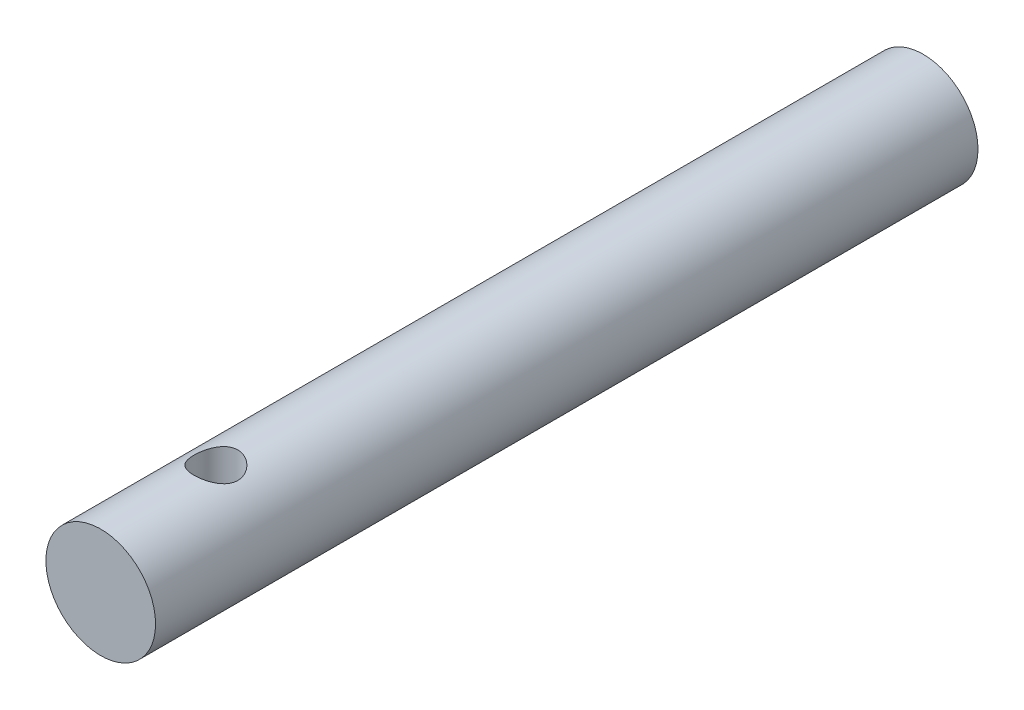
ISO-10303-21;
HEADER;
FILE_DESCRIPTION(('STEP AP214'),'2;1');
FILE_NAME('part.step','',(''),(''),'','','');
FILE_SCHEMA(('AUTOMOTIVE_DESIGN { 1 0 10303 214 1 1 1 1 }'));
ENDSEC;
DATA;
#1=APPLICATION_CONTEXT('core data for automotive mechanical design processes');
#2=APPLICATION_PROTOCOL_DEFINITION('international standard','automotive_design',2000,#1);
#3=PRODUCT_CONTEXT('',#1,'mechanical');
#4=PRODUCT('Part','Part','',(#3));
#5=PRODUCT_RELATED_PRODUCT_CATEGORY('part','',(#4));
#6=PRODUCT_DEFINITION_FORMATION('','',#4);
#7=PRODUCT_DEFINITION_CONTEXT('part definition',#1,'design');
#8=PRODUCT_DEFINITION('design','',#6,#7);
#9=PRODUCT_DEFINITION_SHAPE('','',#8);
#10=(LENGTH_UNIT() NAMED_UNIT(*) SI_UNIT(.MILLI.,.METRE.));
#11=(NAMED_UNIT(*) PLANE_ANGLE_UNIT() SI_UNIT($,.RADIAN.));
#12=(NAMED_UNIT(*) SI_UNIT($,.STERADIAN.) SOLID_ANGLE_UNIT());
#13=UNCERTAINTY_MEASURE_WITH_UNIT(LENGTH_MEASURE(1.E-05),#10,'distance_accuracy_value','');
#14=(GEOMETRIC_REPRESENTATION_CONTEXT(3) GLOBAL_UNCERTAINTY_ASSIGNED_CONTEXT((#13)) GLOBAL_UNIT_ASSIGNED_CONTEXT((#10,
#11,#12)) REPRESENTATION_CONTEXT('',''));
#15=CARTESIAN_POINT('',(0.,0.,0.));
#16=DIRECTION('',(0.,0.,1.));
#17=DIRECTION('',(1.,0.,0.));
#18=AXIS2_PLACEMENT_3D('',#15,#16,#17);
#19=CARTESIAN_POINT('',(0.,0.,150.));
#20=DIRECTION('',(0.,0.,-1.));
#21=DIRECTION('',(-1.,0.,0.));
#22=AXIS2_PLACEMENT_3D('',#19,#20,#21);
#23=CYLINDRICAL_SURFACE('',#22,10.);
#24=CARTESIAN_POINT('',(0.,-10.,133.));
#25=CARTESIAN_POINT('',(0.107549581345537,-9.99999886871264,132.999998425067));
#26=CARTESIAN_POINT('',(0.215132147940362,-9.99825999367799,132.99565632892));
#27=CARTESIAN_POINT('',(0.429535200549549,-9.99134740691108,132.978326617216));
#28=CARTESIAN_POINT('',(0.536355162703302,-9.98617152790588,132.965333546597));
#29=CARTESIAN_POINT('',(0.748635856497416,-9.97250573560117,132.930791965449));
#30=CARTESIAN_POINT('',(0.854093134440867,-9.96400865312143,132.90922494538));
#31=CARTESIAN_POINT('',(1.06266761114009,-9.94393017211574,132.857758269563));
#32=CARTESIAN_POINT('',(1.16578384227259,-9.932347522545,132.827855233745));
#33=CARTESIAN_POINT('',(1.46979509681069,-9.89349112162205,132.726277191284));
#34=CARTESIAN_POINT('',(1.66629107461992,-9.86204458846134,132.642578180994));
#35=CARTESIAN_POINT('',(2.04217417878101,-9.79113035538708,132.44595378265));
#36=CARTESIAN_POINT('',(2.22156721456798,-9.75166544086262,132.333038539885));
#37=CARTESIAN_POINT('',(2.56699339938209,-9.66661825353092,132.075531245478));
#38=CARTESIAN_POINT('',(2.73212223266508,-9.62084608086599,131.929787289424));
#39=CARTESIAN_POINT('',(3.03635232313263,-9.52921139577231,131.613199390848));
#40=CARTESIAN_POINT('',(3.17544084661153,-9.48334885017047,131.442343240983));
#41=CARTESIAN_POINT('',(3.42974847409894,-9.39445587657958,131.071144031434));
#42=CARTESIAN_POINT('',(3.54362978572888,-9.35164233015934,130.869827073936));
#43=CARTESIAN_POINT('',(3.73550961465235,-9.2766729328807,130.448927157199));
#44=CARTESIAN_POINT('',(3.81352517485723,-9.24451202207145,130.229352932259));
#45=CARTESIAN_POINT('',(3.92779760260542,-9.19652715590089,129.788575344314));
#46=CARTESIAN_POINT('',(3.96578791979826,-9.18002840771385,129.567897531912));
#47=CARTESIAN_POINT('',(4.00434593508728,-9.16328008038142,129.122730000323));
#48=CARTESIAN_POINT('',(4.00493203570086,-9.16302251073202,128.898242209989));
#49=CARTESIAN_POINT('',(3.9699787321474,-9.17821000534301,128.468486657777));
#50=CARTESIAN_POINT('',(3.93695062778272,-9.19256349925666,128.262968571234));
#51=CARTESIAN_POINT('',(3.83989376129508,-9.23352375055553,127.86068088765));
#52=CARTESIAN_POINT('',(3.77585958980134,-9.26013264599921,127.663912823694));
#53=CARTESIAN_POINT('',(3.61738946491141,-9.32318970221162,127.279964327708));
#54=CARTESIAN_POINT('',(3.5223597245794,-9.35982758573423,127.093061521918));
#55=CARTESIAN_POINT('',(3.30501292151571,-9.43876232767926,126.73716836725));
#56=CARTESIAN_POINT('',(3.18268561021591,-9.48106130910411,126.568184781187));
#57=CARTESIAN_POINT('',(2.90310119889357,-9.57053473488081,126.239180542404));
#58=CARTESIAN_POINT('',(2.74387492593718,-9.61783329953252,126.08086254111));
#59=CARTESIAN_POINT('',(2.40062885486449,-9.70919649915615,125.792631043994));
#60=CARTESIAN_POINT('',(2.21660413066997,-9.75326048890393,125.662723205179));
#61=CARTESIAN_POINT('',(1.82415530521055,-9.83429362529359,125.432765105169));
#62=CARTESIAN_POINT('',(1.61532098269266,-9.87110540190899,125.333355437606));
#63=CARTESIAN_POINT('',(1.18204753096606,-9.93229656657448,125.171664277844));
#64=CARTESIAN_POINT('',(0.957616393699407,-9.95668226924746,125.109363924885));
#65=CARTESIAN_POINT('',(0.513791775215601,-9.98912279013839,125.027103409161));
#66=CARTESIAN_POINT('',(0.294886587971151,-9.99805891667034,125.004855091493));
#67=CARTESIAN_POINT('',(-0.143690619615697,-10.0013695702126,124.996573798943));
#68=CARTESIAN_POINT('',(-0.363362426448175,-9.99574787164577,125.010531436905));
#69=CARTESIAN_POINT('',(-0.786865478243648,-9.97115134127512,125.072583505104));
#70=CARTESIAN_POINT('',(-0.990964983549755,-9.95278782691064,125.119115960703));
#71=CARTESIAN_POINT('',(-1.38827085612274,-9.90518882810983,125.242871416619));
#72=CARTESIAN_POINT('',(-1.58147582045411,-9.87595194712999,125.320098359335));
#73=CARTESIAN_POINT('',(-1.95815757162884,-9.80833189541687,125.505569879362));
#74=CARTESIAN_POINT('',(-2.14115604549353,-9.76969631959847,125.614690944095));
#75=CARTESIAN_POINT('',(-2.4868871825104,-9.68746729490809,125.859880647803));
#76=CARTESIAN_POINT('',(-2.64961168158684,-9.64387186219643,125.995960085814));
#77=CARTESIAN_POINT('',(-2.96144608598878,-9.55290235277181,126.301740025933));
#78=CARTESIAN_POINT('',(-3.10894786734726,-9.50546882853787,126.473067083141));
#79=CARTESIAN_POINT('',(-3.37350239509234,-9.4148334583058,126.83888016589));
#80=CARTESIAN_POINT('',(-3.4905501236659,-9.37163231039242,127.033370000199));
#81=CARTESIAN_POINT('',(-3.69161500286276,-9.2942859982933,127.442923389673));
#82=CARTESIAN_POINT('',(-3.77530118531766,-9.26023261821741,127.658168000243));
#83=CARTESIAN_POINT('',(-3.90459244315908,-9.20647346903737,128.101467301613));
#84=CARTESIAN_POINT('',(-3.95022562452798,-9.18675711197461,128.329512404842));
#85=CARTESIAN_POINT('',(-3.99943122157417,-9.16543518780389,128.774255809844));
#86=CARTESIAN_POINT('',(-4.0057941177721,-9.16262842667612,128.990589701895));
#87=CARTESIAN_POINT('',(-3.98360636538274,-9.17229671415009,129.421089692721));
#88=CARTESIAN_POINT('',(-3.9550601501471,-9.18476982225497,129.635256063282));
#89=CARTESIAN_POINT('',(-3.86614256488129,-9.2225330048627,130.04666446089));
#90=CARTESIAN_POINT('',(-3.80707437387707,-9.2472967218297,130.244240846221));
#91=CARTESIAN_POINT('',(-3.66001151041638,-9.30647993934965,130.62675696179));
#92=CARTESIAN_POINT('',(-3.57200884934551,-9.34090210615104,130.811693185111));
#93=CARTESIAN_POINT('',(-3.36374310804135,-9.4179725282647,131.175220410709));
#94=CARTESIAN_POINT('',(-3.24192140926545,-9.46097893410836,131.352841830688));
#95=CARTESIAN_POINT('',(-2.97179350239179,-9.54927479921251,131.685982142625));
#96=CARTESIAN_POINT('',(-2.82347931168582,-9.59456494363941,131.84149434729));
#97=CARTESIAN_POINT('',(-2.49297412446701,-9.68587647140964,132.136423592531));
#98=CARTESIAN_POINT('',(-2.30921017071956,-9.73175488236392,132.274143383982));
#99=CARTESIAN_POINT('',(-2.01716584575534,-9.7949502762577,132.456048108938));
#100=CARTESIAN_POINT('',(-1.91699501972426,-9.81509269692655,132.512607063853));
#101=CARTESIAN_POINT('',(-1.71180110982481,-9.85294835133019,132.617037995405));
#102=CARTESIAN_POINT('',(-1.60678027559742,-9.87066269647665,132.664913949808));
#103=CARTESIAN_POINT('',(-1.39454646904327,-9.9028559935491,132.750747984685));
#104=CARTESIAN_POINT('',(-1.28740777135871,-9.91738778532477,132.788870154747));
#105=CARTESIAN_POINT('',(-1.06995577523382,-9.94319722915714,132.855921347721));
#106=CARTESIAN_POINT('',(-0.959643983352608,-9.95447639837582,132.88485465735));
#107=CARTESIAN_POINT('',(-0.736945215856824,-9.97343330649399,132.933174836149));
#108=CARTESIAN_POINT('',(-0.624564263591269,-9.98112017494336,132.952585911645));
#109=CARTESIAN_POINT('',(-0.398419132407593,-9.99270031578293,132.981738570666));
#110=CARTESIAN_POINT('',(-0.284655994966345,-9.99659628445551,132.991487026834));
#111=CARTESIAN_POINT('',(-0.113830463425488,-9.99951445883957,132.998785895573));
#112=CARTESIAN_POINT('',(-0.0569198512645281,-10.0000005987258,133.000000833522));
#113=CARTESIAN_POINT('',(0.,-10.,133.));
#114=B_SPLINE_CURVE_WITH_KNOTS('',3,(#24,#25,#26,#27,#28,#29,#30,#31,#32,#33,#34,#35,#36,#37,
#38,#39,#40,#41,#42,#43,#44,#45,#46,#47,#48,#49,#50,#51,#52,#53,#54,#55,#56,#57,#58,#59,#60,#61,
#62,#63,#64,#65,#66,#67,#68,#69,#70,#71,#72,#73,#74,#75,#76,#77,#78,#79,#80,#81,#82,#83,#84,#85,
#86,#87,#88,#89,#90,#91,#92,#93,#94,#95,#96,#97,#98,#99,#100,#101,#102,#103,#104,#105,#106,#107,
#108,#109,#110,#111,#112,#113),.UNSPECIFIED.,.T.,.F.,(4,2,2,2,2,2,2,2,2,2,2,2,2,2,2,2,2,2,2,2,2,
2,2,2,2,2,2,2,2,2,2,2,2,2,2,2,2,2,2,2,2,2,2,2,4),(0.,0.322603993422155,0.645411604786482,
0.968919914471231,1.29255959093094,1.93701523385824,2.58124739027476,3.25313995292303,
3.9253602176033,4.62749749529945,5.32930078128045,5.99927442509166,6.66891844572485,
7.29195888698824,7.91510806412269,8.55097484497805,9.1870807577654,9.87235930273287,
10.5577741757964,11.2567305822579,11.9553314412776,12.6125760095619,13.2696501904034,
13.8972014302891,14.5248332988777,15.171662586967,15.8187515089811,16.50856181149,
17.1984856998767,17.8950932218183,18.5911857719204,19.2371857868567,19.8831037702626,
20.5034786899771,21.124025035105,21.7801016801356,22.4363763459696,23.1352007896785,
23.4851924266232,23.8350233218042,24.1785111324565,24.52183846562,24.8642884495951,
25.2064946871486,25.3772305569977),.UNSPECIFIED.);
#115=CARTESIAN_POINT('',(0.,-10.,133.));
#116=VERTEX_POINT('',#115);
#117=EDGE_CURVE('E10',#116,#116,#114,.T.);
#118=ORIENTED_EDGE('',*,*,#117,.T.);
#119=EDGE_LOOP('',(#118));
#120=FACE_BOUND('',#119,.T.);
#121=CARTESIAN_POINT('',(0.,10.,133.));
#122=CARTESIAN_POINT('',(-0.107549581345537,9.99999886871264,132.999998425067));
#123=CARTESIAN_POINT('',(-0.215132147940362,9.99825999367799,132.99565632892));
#124=CARTESIAN_POINT('',(-0.429535200549549,9.99134740691108,132.978326617216));
#125=CARTESIAN_POINT('',(-0.536355162703302,9.98617152790588,132.965333546597));
#126=CARTESIAN_POINT('',(-0.748635856497416,9.97250573560117,132.930791965449));
#127=CARTESIAN_POINT('',(-0.854093134440867,9.96400865312143,132.90922494538));
#128=CARTESIAN_POINT('',(-1.06266761114009,9.94393017211574,132.857758269563));
#129=CARTESIAN_POINT('',(-1.16578384227259,9.932347522545,132.827855233745));
#130=CARTESIAN_POINT('',(-1.46979509681069,9.89349112162205,132.726277191284));
#131=CARTESIAN_POINT('',(-1.66629107461992,9.86204458846134,132.642578180994));
#132=CARTESIAN_POINT('',(-2.04217417878101,9.79113035538708,132.44595378265));
#133=CARTESIAN_POINT('',(-2.22156721456798,9.75166544086262,132.333038539885));
#134=CARTESIAN_POINT('',(-2.56699339938209,9.66661825353092,132.075531245478));
#135=CARTESIAN_POINT('',(-2.73212223266508,9.62084608086599,131.929787289424));
#136=CARTESIAN_POINT('',(-3.03635232313263,9.52921139577231,131.613199390848));
#137=CARTESIAN_POINT('',(-3.17544084661153,9.48334885017047,131.442343240983));
#138=CARTESIAN_POINT('',(-3.42974847409894,9.39445587657958,131.071144031434));
#139=CARTESIAN_POINT('',(-3.54362978572888,9.35164233015934,130.869827073936));
#140=CARTESIAN_POINT('',(-3.73550961465235,9.2766729328807,130.448927157199));
#141=CARTESIAN_POINT('',(-3.81352517485723,9.24451202207145,130.229352932259));
#142=CARTESIAN_POINT('',(-3.92779760260542,9.19652715590089,129.788575344314));
#143=CARTESIAN_POINT('',(-3.96578791979826,9.18002840771385,129.567897531912));
#144=CARTESIAN_POINT('',(-4.00434593508728,9.16328008038142,129.122730000323));
#145=CARTESIAN_POINT('',(-4.00493203570086,9.16302251073202,128.898242209989));
#146=CARTESIAN_POINT('',(-3.9699787321474,9.17821000534301,128.468486657777));
#147=CARTESIAN_POINT('',(-3.93695062778272,9.19256349925666,128.262968571234));
#148=CARTESIAN_POINT('',(-3.83989376129508,9.23352375055553,127.86068088765));
#149=CARTESIAN_POINT('',(-3.77585958980134,9.26013264599921,127.663912823694));
#150=CARTESIAN_POINT('',(-3.61738946491141,9.32318970221162,127.279964327708));
#151=CARTESIAN_POINT('',(-3.5223597245794,9.35982758573423,127.093061521918));
#152=CARTESIAN_POINT('',(-3.30501292151571,9.43876232767926,126.73716836725));
#153=CARTESIAN_POINT('',(-3.18268561021591,9.48106130910411,126.568184781187));
#154=CARTESIAN_POINT('',(-2.90310119889357,9.57053473488081,126.239180542404));
#155=CARTESIAN_POINT('',(-2.74387492593718,9.61783329953252,126.08086254111));
#156=CARTESIAN_POINT('',(-2.40062885486449,9.70919649915615,125.792631043994));
#157=CARTESIAN_POINT('',(-2.21660413066997,9.75326048890393,125.662723205179));
#158=CARTESIAN_POINT('',(-1.82415530521055,9.83429362529359,125.432765105169));
#159=CARTESIAN_POINT('',(-1.61532098269266,9.87110540190899,125.333355437606));
#160=CARTESIAN_POINT('',(-1.18204753096606,9.93229656657448,125.171664277844));
#161=CARTESIAN_POINT('',(-0.957616393699407,9.95668226924746,125.109363924885));
#162=CARTESIAN_POINT('',(-0.513791775215601,9.98912279013839,125.027103409161));
#163=CARTESIAN_POINT('',(-0.294886587971151,9.99805891667034,125.004855091493));
#164=CARTESIAN_POINT('',(0.143690619615697,10.0013695702126,124.996573798943));
#165=CARTESIAN_POINT('',(0.363362426448175,9.99574787164577,125.010531436905));
#166=CARTESIAN_POINT('',(0.786865478243648,9.97115134127512,125.072583505104));
#167=CARTESIAN_POINT('',(0.990964983549755,9.95278782691064,125.119115960703));
#168=CARTESIAN_POINT('',(1.38827085612274,9.90518882810983,125.242871416619));
#169=CARTESIAN_POINT('',(1.58147582045411,9.87595194712999,125.320098359335));
#170=CARTESIAN_POINT('',(1.95815757162884,9.80833189541687,125.505569879362));
#171=CARTESIAN_POINT('',(2.14115604549353,9.76969631959847,125.614690944095));
#172=CARTESIAN_POINT('',(2.4868871825104,9.68746729490809,125.859880647803));
#173=CARTESIAN_POINT('',(2.64961168158684,9.64387186219643,125.995960085814));
#174=CARTESIAN_POINT('',(2.96144608598878,9.55290235277181,126.301740025933));
#175=CARTESIAN_POINT('',(3.10894786734726,9.50546882853787,126.473067083141));
#176=CARTESIAN_POINT('',(3.37350239509234,9.4148334583058,126.83888016589));
#177=CARTESIAN_POINT('',(3.4905501236659,9.37163231039242,127.033370000199));
#178=CARTESIAN_POINT('',(3.69161500286276,9.2942859982933,127.442923389673));
#179=CARTESIAN_POINT('',(3.77530118531766,9.26023261821741,127.658168000243));
#180=CARTESIAN_POINT('',(3.90459244315908,9.20647346903737,128.101467301613));
#181=CARTESIAN_POINT('',(3.95022562452798,9.18675711197461,128.329512404842));
#182=CARTESIAN_POINT('',(3.99943122157417,9.16543518780389,128.774255809844));
#183=CARTESIAN_POINT('',(4.0057941177721,9.16262842667612,128.990589701895));
#184=CARTESIAN_POINT('',(3.98360636538274,9.17229671415009,129.421089692721));
#185=CARTESIAN_POINT('',(3.9550601501471,9.18476982225497,129.635256063282));
#186=CARTESIAN_POINT('',(3.86614256488129,9.2225330048627,130.04666446089));
#187=CARTESIAN_POINT('',(3.80707437387707,9.2472967218297,130.244240846221));
#188=CARTESIAN_POINT('',(3.66001151041638,9.30647993934965,130.62675696179));
#189=CARTESIAN_POINT('',(3.57200884934551,9.34090210615104,130.811693185111));
#190=CARTESIAN_POINT('',(3.36374310804135,9.4179725282647,131.175220410709));
#191=CARTESIAN_POINT('',(3.24192140926545,9.46097893410836,131.352841830688));
#192=CARTESIAN_POINT('',(2.97179350239179,9.54927479921251,131.685982142625));
#193=CARTESIAN_POINT('',(2.82347931168582,9.59456494363941,131.84149434729));
#194=CARTESIAN_POINT('',(2.49297412446701,9.68587647140964,132.136423592531));
#195=CARTESIAN_POINT('',(2.30921017071956,9.73175488236392,132.274143383982));
#196=CARTESIAN_POINT('',(2.01716584575534,9.7949502762577,132.456048108938));
#197=CARTESIAN_POINT('',(1.91699501972426,9.81509269692655,132.512607063853));
#198=CARTESIAN_POINT('',(1.71180110982481,9.85294835133019,132.617037995405));
#199=CARTESIAN_POINT('',(1.60678027559742,9.87066269647665,132.664913949808));
#200=CARTESIAN_POINT('',(1.39454646904327,9.9028559935491,132.750747984685));
#201=CARTESIAN_POINT('',(1.28740777135871,9.91738778532477,132.788870154747));
#202=CARTESIAN_POINT('',(1.06995577523382,9.94319722915714,132.855921347721));
#203=CARTESIAN_POINT('',(0.959643983352608,9.95447639837582,132.88485465735));
#204=CARTESIAN_POINT('',(0.736945215856824,9.97343330649399,132.933174836149));
#205=CARTESIAN_POINT('',(0.624564263591269,9.98112017494336,132.952585911645));
#206=CARTESIAN_POINT('',(0.398419132407593,9.99270031578293,132.981738570666));
#207=CARTESIAN_POINT('',(0.284655994966345,9.99659628445551,132.991487026834));
#208=CARTESIAN_POINT('',(0.113830463425488,9.99951445883957,132.998785895573));
#209=CARTESIAN_POINT('',(0.0569198512645281,10.0000005987258,133.000000833522));
#210=CARTESIAN_POINT('',(0.,10.,133.));
#211=B_SPLINE_CURVE_WITH_KNOTS('',3,(#121,#122,#123,#124,#125,#126,#127,#128,#129,#130,#131,
#132,#133,#134,#135,#136,#137,#138,#139,#140,#141,#142,#143,#144,#145,#146,#147,#148,#149,#150,
#151,#152,#153,#154,#155,#156,#157,#158,#159,#160,#161,#162,#163,#164,#165,#166,#167,#168,#169,
#170,#171,#172,#173,#174,#175,#176,#177,#178,#179,#180,#181,#182,#183,#184,#185,#186,#187,#188,
#189,#190,#191,#192,#193,#194,#195,#196,#197,#198,#199,#200,#201,#202,#203,#204,#205,#206,#207,
#208,#209,#210),.UNSPECIFIED.,.T.,.F.,(4,2,2,2,2,2,2,2,2,2,2,2,2,2,2,2,2,2,2,2,2,2,2,2,2,2,2,2,
2,2,2,2,2,2,2,2,2,2,2,2,2,2,2,2,4),(0.,0.322603993422155,0.645411604786482,0.968919914471231,
1.29255959093094,1.93701523385824,2.58124739027476,3.25313995292303,3.9253602176033,
4.62749749529945,5.32930078128045,5.99927442509166,6.66891844572485,7.29195888698824,
7.91510806412269,8.55097484497805,9.1870807577654,9.87235930273287,10.5577741757964,
11.2567305822579,11.9553314412776,12.6125760095619,13.2696501904034,13.8972014302891,
14.5248332988777,15.171662586967,15.8187515089811,16.50856181149,17.1984856998767,
17.8950932218183,18.5911857719204,19.2371857868567,19.8831037702626,20.5034786899771,
21.124025035105,21.7801016801356,22.4363763459696,23.1352007896785,23.4851924266232,
23.8350233218042,24.1785111324565,24.52183846562,24.8642884495951,25.2064946871486,
25.3772305569977),.UNSPECIFIED.);
#212=CARTESIAN_POINT('',(0.,10.,133.));
#213=VERTEX_POINT('',#212);
#214=EDGE_CURVE('E45',#213,#213,#211,.T.);
#215=ORIENTED_EDGE('',*,*,#214,.T.);
#216=EDGE_LOOP('',(#215));
#217=FACE_BOUND('',#216,.T.);
#218=CARTESIAN_POINT('',(0.,0.,150.));
#219=DIRECTION('',(0.,0.,1.));
#220=DIRECTION('',(1.,0.,0.));
#221=AXIS2_PLACEMENT_3D('',#218,#219,#220);
#222=CIRCLE('',#221,10.);
#223=CARTESIAN_POINT('',(10.,0.,150.));
#224=VERTEX_POINT('',#223);
#225=EDGE_CURVE('E49',#224,#224,#222,.T.);
#226=ORIENTED_EDGE('',*,*,#225,.F.);
#227=EDGE_LOOP('',(#226));
#228=FACE_BOUND('',#227,.T.);
#229=CARTESIAN_POINT('',(0.,0.,0.));
#230=DIRECTION('',(0.,0.,1.));
#231=DIRECTION('',(1.,0.,0.));
#232=AXIS2_PLACEMENT_3D('',#229,#230,#231);
#233=CIRCLE('',#232,10.);
#234=CARTESIAN_POINT('',(10.,0.,0.));
#235=VERTEX_POINT('',#234);
#236=EDGE_CURVE('E53',#235,#235,#233,.T.);
#237=ORIENTED_EDGE('',*,*,#236,.T.);
#238=EDGE_LOOP('',(#237));
#239=FACE_BOUND('',#238,.T.);
#240=ADVANCED_FACE('F35',(#120,#217,#228,#239),#23,.T.);
#241=CARTESIAN_POINT('',(0.,0.,150.));
#242=DIRECTION('',(0.,0.,1.));
#243=DIRECTION('',(1.,0.,0.));
#244=AXIS2_PLACEMENT_3D('',#241,#242,#243);
#245=PLANE('',#244);
#246=ORIENTED_EDGE('',*,*,#225,.T.);
#247=EDGE_LOOP('',(#246));
#248=FACE_BOUND('',#247,.T.);
#249=ADVANCED_FACE('F64',(#248),#245,.T.);
#250=CARTESIAN_POINT('',(0.,0.,0.));
#251=DIRECTION('',(0.,0.,1.));
#252=DIRECTION('',(1.,0.,0.));
#253=AXIS2_PLACEMENT_3D('',#250,#251,#252);
#254=PLANE('',#253);
#255=ORIENTED_EDGE('',*,*,#236,.F.);
#256=EDGE_LOOP('',(#255));
#257=FACE_BOUND('',#256,.T.);
#258=ADVANCED_FACE('F62',(#257),#254,.F.);
#259=CARTESIAN_POINT('',(0.,-10.,129.));
#260=DIRECTION('',(0.,1.,0.));
#261=DIRECTION('',(0.,0.,1.));
#262=AXIS2_PLACEMENT_3D('',#259,#260,#261);
#263=CYLINDRICAL_SURFACE('',#262,4.);
#264=ORIENTED_EDGE('',*,*,#214,.F.);
#265=EDGE_LOOP('',(#264));
#266=FACE_BOUND('',#265,.T.);
#267=ORIENTED_EDGE('',*,*,#117,.F.);
#268=EDGE_LOOP('',(#267));
#269=FACE_BOUND('',#268,.T.);
#270=ADVANCED_FACE('F58',(#266,#269),#263,.F.);
#271=CLOSED_SHELL('',(#240,#249,#258,#270));
#272=MANIFOLD_SOLID_BREP('B2',#271);
#273=ADVANCED_BREP_SHAPE_REPRESENTATION('',(#18,#272),#14);
#274=SHAPE_DEFINITION_REPRESENTATION(#9,#273);
ENDSEC;
END-ISO-10303-21;
